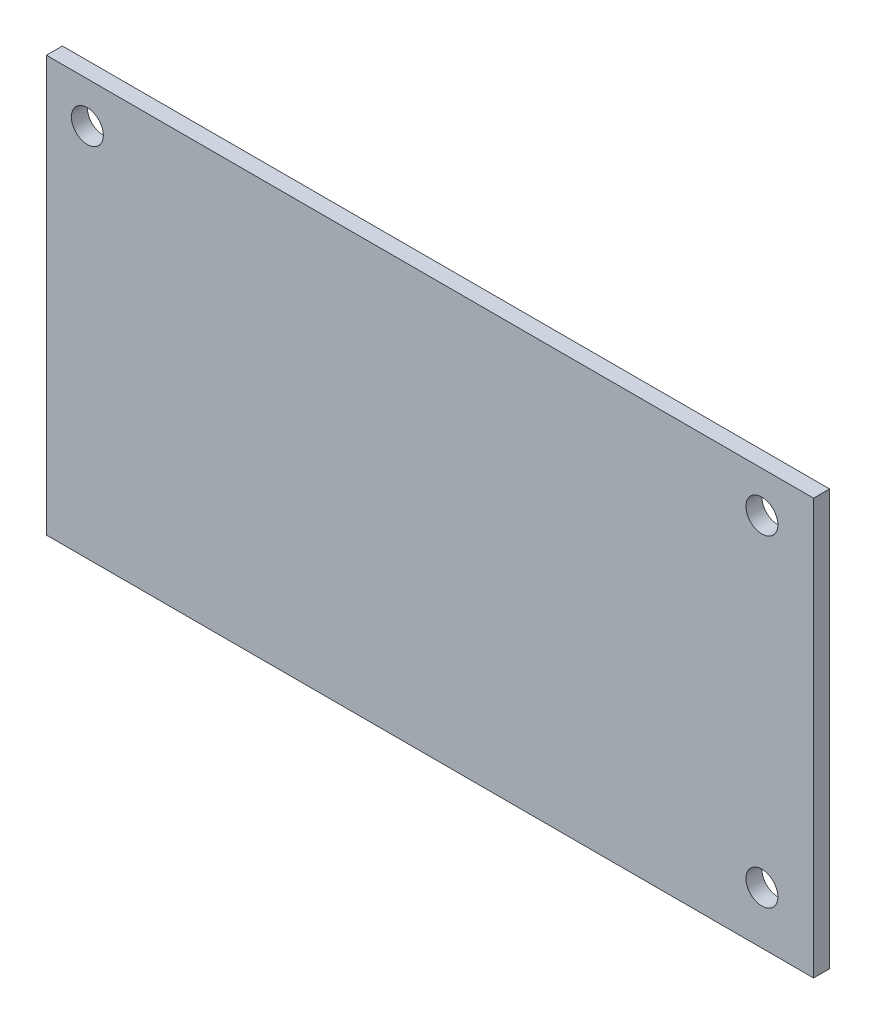
ISO-10303-21;
HEADER;
FILE_DESCRIPTION(('STEP AP214'),'2;1');
FILE_NAME('part.step','',(''),(''),'','','');
FILE_SCHEMA(('AUTOMOTIVE_DESIGN { 1 0 10303 214 1 1 1 1 }'));
ENDSEC;
DATA;
#1=APPLICATION_CONTEXT('core data for automotive mechanical design processes');
#2=APPLICATION_PROTOCOL_DEFINITION('international standard','automotive_design',2000,#1);
#3=PRODUCT_CONTEXT('',#1,'mechanical');
#4=PRODUCT('Part','Part','',(#3));
#5=PRODUCT_RELATED_PRODUCT_CATEGORY('part','',(#4));
#6=PRODUCT_DEFINITION_FORMATION('','',#4);
#7=PRODUCT_DEFINITION_CONTEXT('part definition',#1,'design');
#8=PRODUCT_DEFINITION('design','',#6,#7);
#9=PRODUCT_DEFINITION_SHAPE('','',#8);
#10=(LENGTH_UNIT() NAMED_UNIT(*) SI_UNIT(.MILLI.,.METRE.));
#11=(NAMED_UNIT(*) PLANE_ANGLE_UNIT() SI_UNIT($,.RADIAN.));
#12=(NAMED_UNIT(*) SI_UNIT($,.STERADIAN.) SOLID_ANGLE_UNIT());
#13=UNCERTAINTY_MEASURE_WITH_UNIT(LENGTH_MEASURE(1.E-05),#10,'distance_accuracy_value','');
#14=(GEOMETRIC_REPRESENTATION_CONTEXT(3) GLOBAL_UNCERTAINTY_ASSIGNED_CONTEXT((#13)) GLOBAL_UNIT_ASSIGNED_CONTEXT((#10,
#11,#12)) REPRESENTATION_CONTEXT('',''));
#15=CARTESIAN_POINT('',(0.,0.,0.));
#16=DIRECTION('',(0.,0.,1.));
#17=DIRECTION('',(1.,0.,0.));
#18=AXIS2_PLACEMENT_3D('',#15,#16,#17);
#19=CARTESIAN_POINT('',(0.,0.,1.5875));
#20=DIRECTION('',(0.,0.,-1.));
#21=DIRECTION('',(-1.,0.,0.));
#22=AXIS2_PLACEMENT_3D('',#19,#20,#21);
#23=PLANE('',#22);
#24=DIRECTION('',(0.,-1.,0.));
#25=VECTOR('',#24,1.);
#26=CARTESIAN_POINT('',(0.,0.,1.5875));
#27=LINE('',#26,#25);
#28=CARTESIAN_POINT('',(0.,41.275,1.5875));
#29=VERTEX_POINT('',#28);
#30=CARTESIAN_POINT('',(0.,0.,1.5875));
#31=VERTEX_POINT('',#30);
#32=EDGE_CURVE('E85',#29,#31,#27,.T.);
#33=ORIENTED_EDGE('',*,*,#32,.T.);
#34=DIRECTION('',(1.,0.,0.));
#35=VECTOR('',#34,1.);
#36=CARTESIAN_POINT('',(0.,0.,1.5875));
#37=LINE('',#36,#35);
#38=CARTESIAN_POINT('',(76.2,0.,1.5875));
#39=VERTEX_POINT('',#38);
#40=EDGE_CURVE('E80',#31,#39,#37,.T.);
#41=ORIENTED_EDGE('',*,*,#40,.T.);
#42=DIRECTION('',(0.,1.,0.));
#43=VECTOR('',#42,1.);
#44=CARTESIAN_POINT('',(76.2,0.,1.5875));
#45=LINE('',#44,#43);
#46=CARTESIAN_POINT('',(76.2,41.275,1.5875));
#47=VERTEX_POINT('',#46);
#48=EDGE_CURVE('E83',#39,#47,#45,.T.);
#49=ORIENTED_EDGE('',*,*,#48,.T.);
#50=DIRECTION('',(-1.,0.,0.));
#51=VECTOR('',#50,1.);
#52=CARTESIAN_POINT('',(0.,41.275,1.5875));
#53=LINE('',#52,#51);
#54=EDGE_CURVE('E50',#47,#29,#53,.T.);
#55=ORIENTED_EDGE('',*,*,#54,.T.);
#56=EDGE_LOOP('',(#33,#41,#49,#55));
#57=FACE_BOUND('',#56,.T.);
#58=CARTESIAN_POINT('',(4.06399999999999,37.211,1.5875));
#59=DIRECTION('',(0.,0.,1.));
#60=DIRECTION('',(1.,0.,0.));
#61=AXIS2_PLACEMENT_3D('',#58,#59,#60);
#62=CIRCLE('',#61,1.5875);
#63=CARTESIAN_POINT('',(5.65149999999999,37.211,1.5875));
#64=VERTEX_POINT('',#63);
#65=EDGE_CURVE('E100',#64,#64,#62,.T.);
#66=ORIENTED_EDGE('',*,*,#65,.F.);
#67=EDGE_LOOP('',(#66));
#68=FACE_BOUND('',#67,.T.);
#69=CARTESIAN_POINT('',(71.064,37.211,1.5875));
#70=DIRECTION('',(0.,0.,1.));
#71=DIRECTION('',(1.,0.,0.));
#72=AXIS2_PLACEMENT_3D('',#69,#70,#71);
#73=CIRCLE('',#72,1.5875);
#74=CARTESIAN_POINT('',(72.6515,37.211,1.5875));
#75=VERTEX_POINT('',#74);
#76=EDGE_CURVE('E115',#75,#75,#73,.T.);
#77=ORIENTED_EDGE('',*,*,#76,.F.);
#78=EDGE_LOOP('',(#77));
#79=FACE_BOUND('',#78,.T.);
#80=CARTESIAN_POINT('',(71.064,5.207,1.5875));
#81=DIRECTION('',(0.,0.,1.));
#82=DIRECTION('',(1.,0.,0.));
#83=AXIS2_PLACEMENT_3D('',#80,#81,#82);
#84=CIRCLE('',#83,1.5875);
#85=CARTESIAN_POINT('',(72.6515,5.207,1.5875));
#86=VERTEX_POINT('',#85);
#87=EDGE_CURVE('E121',#86,#86,#84,.T.);
#88=ORIENTED_EDGE('',*,*,#87,.F.);
#89=EDGE_LOOP('',(#88));
#90=FACE_BOUND('',#89,.T.);
#91=ADVANCED_FACE('F33',(#57,#68,#79,#90),#23,.F.);
#92=CARTESIAN_POINT('',(0.,0.,0.));
#93=DIRECTION('',(0.,0.,-1.));
#94=DIRECTION('',(-1.,0.,0.));
#95=AXIS2_PLACEMENT_3D('',#92,#93,#94);
#96=PLANE('',#95);
#97=CARTESIAN_POINT('',(71.064,37.211,0.));
#98=DIRECTION('',(0.,0.,1.));
#99=DIRECTION('',(1.,0.,0.));
#100=AXIS2_PLACEMENT_3D('',#97,#98,#99);
#101=CIRCLE('',#100,1.5875);
#102=CARTESIAN_POINT('',(72.6515,37.211,0.));
#103=VERTEX_POINT('',#102);
#104=EDGE_CURVE('E118',#103,#103,#101,.T.);
#105=ORIENTED_EDGE('',*,*,#104,.T.);
#106=EDGE_LOOP('',(#105));
#107=FACE_BOUND('',#106,.T.);
#108=DIRECTION('',(0.,-1.,0.));
#109=VECTOR('',#108,1.);
#110=CARTESIAN_POINT('',(0.,0.,0.));
#111=LINE('',#110,#109);
#112=CARTESIAN_POINT('',(0.,41.275,0.));
#113=VERTEX_POINT('',#112);
#114=CARTESIAN_POINT('',(0.,0.,0.));
#115=VERTEX_POINT('',#114);
#116=EDGE_CURVE('E97',#113,#115,#111,.T.);
#117=ORIENTED_EDGE('',*,*,#116,.F.);
#118=DIRECTION('',(-1.,0.,0.));
#119=VECTOR('',#118,1.);
#120=CARTESIAN_POINT('',(0.,41.275,0.));
#121=LINE('',#120,#119);
#122=CARTESIAN_POINT('',(76.2,41.275,0.));
#123=VERTEX_POINT('',#122);
#124=EDGE_CURVE('E73',#123,#113,#121,.T.);
#125=ORIENTED_EDGE('',*,*,#124,.F.);
#126=DIRECTION('',(0.,1.,0.));
#127=VECTOR('',#126,1.);
#128=CARTESIAN_POINT('',(76.2,0.,0.));
#129=LINE('',#128,#127);
#130=CARTESIAN_POINT('',(76.2,0.,0.));
#131=VERTEX_POINT('',#130);
#132=EDGE_CURVE('E67',#131,#123,#129,.T.);
#133=ORIENTED_EDGE('',*,*,#132,.F.);
#134=DIRECTION('',(1.,0.,0.));
#135=VECTOR('',#134,1.);
#136=CARTESIAN_POINT('',(0.,0.,0.));
#137=LINE('',#136,#135);
#138=EDGE_CURVE('E89',#115,#131,#137,.T.);
#139=ORIENTED_EDGE('',*,*,#138,.F.);
#140=EDGE_LOOP('',(#117,#125,#133,#139));
#141=FACE_BOUND('',#140,.T.);
#142=CARTESIAN_POINT('',(4.06399999999999,37.211,0.));
#143=DIRECTION('',(0.,0.,1.));
#144=DIRECTION('',(1.,0.,0.));
#145=AXIS2_PLACEMENT_3D('',#142,#143,#144);
#146=CIRCLE('',#145,1.5875);
#147=CARTESIAN_POINT('',(5.65149999999999,37.211,0.));
#148=VERTEX_POINT('',#147);
#149=EDGE_CURVE('E112',#148,#148,#146,.T.);
#150=ORIENTED_EDGE('',*,*,#149,.T.);
#151=EDGE_LOOP('',(#150));
#152=FACE_BOUND('',#151,.T.);
#153=CARTESIAN_POINT('',(71.064,5.207,0.));
#154=DIRECTION('',(0.,0.,1.));
#155=DIRECTION('',(1.,0.,0.));
#156=AXIS2_PLACEMENT_3D('',#153,#154,#155);
#157=CIRCLE('',#156,1.5875);
#158=CARTESIAN_POINT('',(72.6515,5.207,0.));
#159=VERTEX_POINT('',#158);
#160=EDGE_CURVE('E124',#159,#159,#157,.T.);
#161=ORIENTED_EDGE('',*,*,#160,.T.);
#162=EDGE_LOOP('',(#161));
#163=FACE_BOUND('',#162,.T.);
#164=ADVANCED_FACE('F108',(#107,#141,#152,#163),#96,.T.);
#165=CARTESIAN_POINT('',(0.,0.,1.5875));
#166=DIRECTION('',(1.,0.,0.));
#167=DIRECTION('',(0.,1.,0.));
#168=AXIS2_PLACEMENT_3D('',#165,#166,#167);
#169=PLANE('',#168);
#170=ORIENTED_EDGE('',*,*,#116,.T.);
#171=DIRECTION('',(0.,0.,-1.));
#172=VECTOR('',#171,1.);
#173=CARTESIAN_POINT('',(0.,0.,1.5875));
#174=LINE('',#173,#172);
#175=EDGE_CURVE('E11',#31,#115,#174,.T.);
#176=ORIENTED_EDGE('',*,*,#175,.F.);
#177=ORIENTED_EDGE('',*,*,#32,.F.);
#178=DIRECTION('',(0.,0.,-1.));
#179=VECTOR('',#178,1.);
#180=CARTESIAN_POINT('',(0.,41.275,1.5875));
#181=LINE('',#180,#179);
#182=EDGE_CURVE('E93',#29,#113,#181,.T.);
#183=ORIENTED_EDGE('',*,*,#182,.T.);
#184=EDGE_LOOP('',(#170,#176,#177,#183));
#185=FACE_BOUND('',#184,.T.);
#186=ADVANCED_FACE('F35',(#185),#169,.F.);
#187=CARTESIAN_POINT('',(0.,0.,1.5875));
#188=DIRECTION('',(0.,1.,0.));
#189=DIRECTION('',(0.,0.,1.));
#190=AXIS2_PLACEMENT_3D('',#187,#188,#189);
#191=PLANE('',#190);
#192=ORIENTED_EDGE('',*,*,#138,.T.);
#193=DIRECTION('',(0.,0.,-1.));
#194=VECTOR('',#193,1.);
#195=CARTESIAN_POINT('',(76.2,0.,1.5875));
#196=LINE('',#195,#194);
#197=EDGE_CURVE('E42',#39,#131,#196,.T.);
#198=ORIENTED_EDGE('',*,*,#197,.F.);
#199=ORIENTED_EDGE('',*,*,#40,.F.);
#200=ORIENTED_EDGE('',*,*,#175,.T.);
#201=EDGE_LOOP('',(#192,#198,#199,#200));
#202=FACE_BOUND('',#201,.T.);
#203=ADVANCED_FACE('F88',(#202),#191,.F.);
#204=CARTESIAN_POINT('',(76.2,0.,1.5875));
#205=DIRECTION('',(-1.,0.,0.));
#206=DIRECTION('',(0.,-1.,0.));
#207=AXIS2_PLACEMENT_3D('',#204,#205,#206);
#208=PLANE('',#207);
#209=ORIENTED_EDGE('',*,*,#132,.T.);
#210=DIRECTION('',(0.,0.,-1.));
#211=VECTOR('',#210,1.);
#212=CARTESIAN_POINT('',(76.2,41.275,1.5875));
#213=LINE('',#212,#211);
#214=EDGE_CURVE('E90',#47,#123,#213,.T.);
#215=ORIENTED_EDGE('',*,*,#214,.F.);
#216=ORIENTED_EDGE('',*,*,#48,.F.);
#217=ORIENTED_EDGE('',*,*,#197,.T.);
#218=EDGE_LOOP('',(#209,#215,#216,#217));
#219=FACE_BOUND('',#218,.T.);
#220=ADVANCED_FACE('F91',(#219),#208,.F.);
#221=CARTESIAN_POINT('',(0.,41.275,1.5875));
#222=DIRECTION('',(0.,-1.,0.));
#223=DIRECTION('',(0.,0.,-1.));
#224=AXIS2_PLACEMENT_3D('',#221,#222,#223);
#225=PLANE('',#224);
#226=ORIENTED_EDGE('',*,*,#124,.T.);
#227=ORIENTED_EDGE('',*,*,#182,.F.);
#228=ORIENTED_EDGE('',*,*,#54,.F.);
#229=ORIENTED_EDGE('',*,*,#214,.T.);
#230=EDGE_LOOP('',(#226,#227,#228,#229));
#231=FACE_BOUND('',#230,.T.);
#232=ADVANCED_FACE('F105',(#231),#225,.F.);
#233=CARTESIAN_POINT('',(4.06399999999999,37.211,1.5875));
#234=DIRECTION('',(0.,0.,-1.));
#235=DIRECTION('',(-1.,0.,0.));
#236=AXIS2_PLACEMENT_3D('',#233,#234,#235);
#237=CYLINDRICAL_SURFACE('',#236,1.5875);
#238=ORIENTED_EDGE('',*,*,#65,.T.);
#239=EDGE_LOOP('',(#238));
#240=FACE_BOUND('',#239,.T.);
#241=ORIENTED_EDGE('',*,*,#149,.F.);
#242=EDGE_LOOP('',(#241));
#243=FACE_BOUND('',#242,.T.);
#244=ADVANCED_FACE('F141',(#240,#243),#237,.F.);
#245=CARTESIAN_POINT('',(71.064,37.211,1.5875));
#246=DIRECTION('',(0.,0.,-1.));
#247=DIRECTION('',(-1.,0.,0.));
#248=AXIS2_PLACEMENT_3D('',#245,#246,#247);
#249=CYLINDRICAL_SURFACE('',#248,1.5875);
#250=ORIENTED_EDGE('',*,*,#76,.T.);
#251=EDGE_LOOP('',(#250));
#252=FACE_BOUND('',#251,.T.);
#253=ORIENTED_EDGE('',*,*,#104,.F.);
#254=EDGE_LOOP('',(#253));
#255=FACE_BOUND('',#254,.T.);
#256=ADVANCED_FACE('F187',(#252,#255),#249,.F.);
#257=CARTESIAN_POINT('',(71.064,5.207,1.5875));
#258=DIRECTION('',(0.,0.,-1.));
#259=DIRECTION('',(-1.,0.,0.));
#260=AXIS2_PLACEMENT_3D('',#257,#258,#259);
#261=CYLINDRICAL_SURFACE('',#260,1.5875);
#262=ORIENTED_EDGE('',*,*,#87,.T.);
#263=EDGE_LOOP('',(#262));
#264=FACE_BOUND('',#263,.T.);
#265=ORIENTED_EDGE('',*,*,#160,.F.);
#266=EDGE_LOOP('',(#265));
#267=FACE_BOUND('',#266,.T.);
#268=ADVANCED_FACE('F130',(#264,#267),#261,.F.);
#269=CLOSED_SHELL('',(#91,#164,#186,#203,#220,#232,#244,#256,#268));
#270=MANIFOLD_SOLID_BREP('B2',#269);
#271=ADVANCED_BREP_SHAPE_REPRESENTATION('',(#18,#270),#14);
#272=SHAPE_DEFINITION_REPRESENTATION(#9,#271);
ENDSEC;
END-ISO-10303-21;
